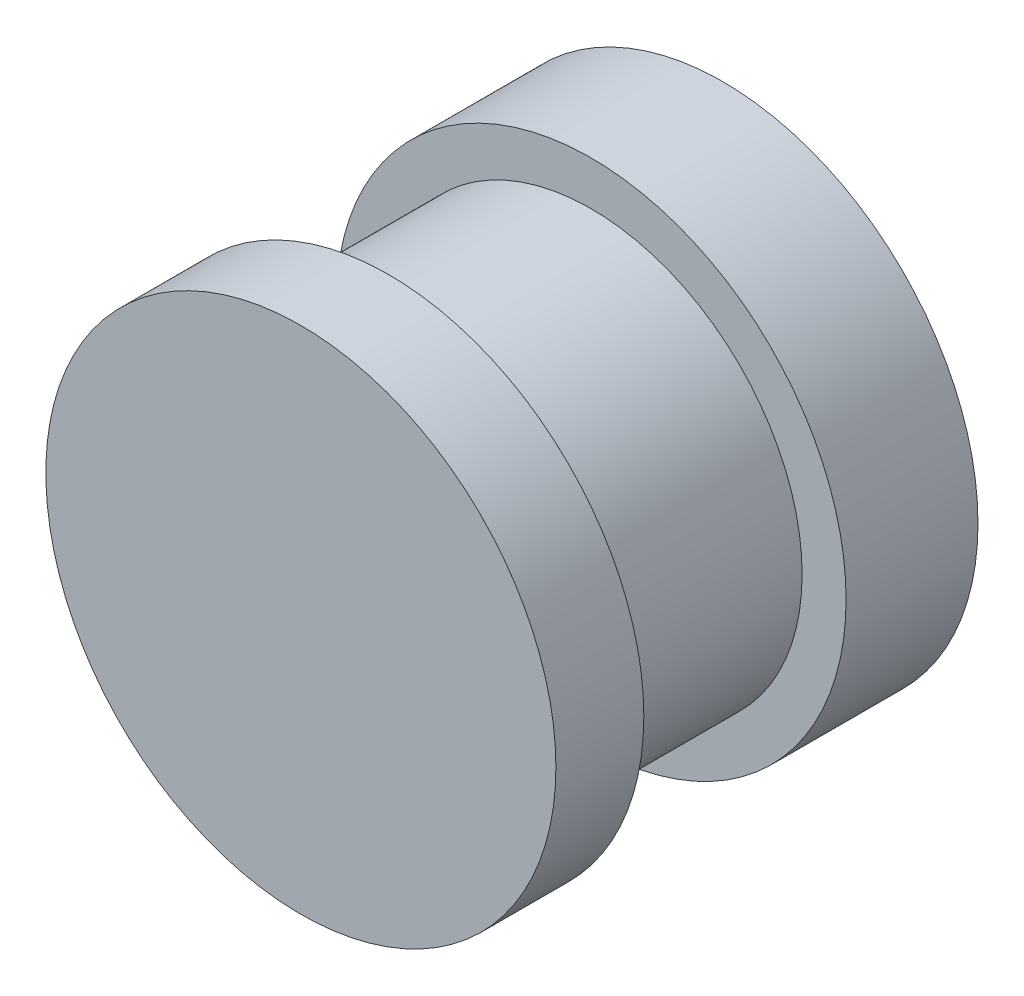
ISO-10303-21;
HEADER;
FILE_DESCRIPTION(('STEP AP214'),'2;1');
FILE_NAME('part.step','',(''),(''),'','','');
FILE_SCHEMA(('AUTOMOTIVE_DESIGN { 1 0 10303 214 1 1 1 1 }'));
ENDSEC;
DATA;
#1=APPLICATION_CONTEXT('core data for automotive mechanical design processes');
#2=APPLICATION_PROTOCOL_DEFINITION('international standard','automotive_design',2000,#1);
#3=PRODUCT_CONTEXT('',#1,'mechanical');
#4=PRODUCT('Part','Part','',(#3));
#5=PRODUCT_RELATED_PRODUCT_CATEGORY('part','',(#4));
#6=PRODUCT_DEFINITION_FORMATION('','',#4);
#7=PRODUCT_DEFINITION_CONTEXT('part definition',#1,'design');
#8=PRODUCT_DEFINITION('design','',#6,#7);
#9=PRODUCT_DEFINITION_SHAPE('','',#8);
#10=(LENGTH_UNIT() NAMED_UNIT(*) SI_UNIT(.MILLI.,.METRE.));
#11=(NAMED_UNIT(*) PLANE_ANGLE_UNIT() SI_UNIT($,.RADIAN.));
#12=(NAMED_UNIT(*) SI_UNIT($,.STERADIAN.) SOLID_ANGLE_UNIT());
#13=UNCERTAINTY_MEASURE_WITH_UNIT(LENGTH_MEASURE(1.E-05),#10,'distance_accuracy_value','');
#14=(GEOMETRIC_REPRESENTATION_CONTEXT(3) GLOBAL_UNCERTAINTY_ASSIGNED_CONTEXT((#13)) GLOBAL_UNIT_ASSIGNED_CONTEXT((#10,
#11,#12)) REPRESENTATION_CONTEXT('',''));
#15=CARTESIAN_POINT('',(0.,0.,0.));
#16=DIRECTION('',(0.,0.,1.));
#17=DIRECTION('',(1.,0.,0.));
#18=AXIS2_PLACEMENT_3D('',#15,#16,#17);
#19=CARTESIAN_POINT('',(0.,0.,1.5));
#20=DIRECTION('',(0.,0.,-1.));
#21=DIRECTION('',(-1.,0.,0.));
#22=AXIS2_PLACEMENT_3D('',#19,#20,#21);
#23=CYLINDRICAL_SURFACE('',#22,2.9);
#24=CARTESIAN_POINT('',(0.,0.,1.5));
#25=DIRECTION('',(0.,0.,1.));
#26=DIRECTION('',(1.,0.,0.));
#27=AXIS2_PLACEMENT_3D('',#24,#25,#26);
#28=CIRCLE('',#27,2.9);
#29=CARTESIAN_POINT('',(2.9,0.,1.5));
#30=VERTEX_POINT('',#29);
#31=EDGE_CURVE('E42',#30,#30,#28,.T.);
#32=ORIENTED_EDGE('',*,*,#31,.F.);
#33=EDGE_LOOP('',(#32));
#34=FACE_BOUND('',#33,.T.);
#35=CARTESIAN_POINT('',(0.,0.,0.));
#36=DIRECTION('',(0.,0.,1.));
#37=DIRECTION('',(1.,0.,0.));
#38=AXIS2_PLACEMENT_3D('',#35,#36,#37);
#39=CIRCLE('',#38,2.9);
#40=CARTESIAN_POINT('',(2.9,0.,0.));
#41=VERTEX_POINT('',#40);
#42=EDGE_CURVE('E38',#41,#41,#39,.T.);
#43=ORIENTED_EDGE('',*,*,#42,.T.);
#44=EDGE_LOOP('',(#43));
#45=FACE_BOUND('',#44,.T.);
#46=ADVANCED_FACE('F35',(#34,#45),#23,.T.);
#47=CARTESIAN_POINT('',(0.,0.,1.5));
#48=DIRECTION('',(0.,0.,1.));
#49=DIRECTION('',(1.,0.,0.));
#50=AXIS2_PLACEMENT_3D('',#47,#48,#49);
#51=PLANE('',#50);
#52=CARTESIAN_POINT('',(0.,0.,1.5));
#53=DIRECTION('',(0.,0.,1.));
#54=DIRECTION('',(1.,0.,0.));
#55=AXIS2_PLACEMENT_3D('',#52,#53,#54);
#56=CIRCLE('',#55,2.4);
#57=CARTESIAN_POINT('',(2.4,0.,1.5));
#58=VERTEX_POINT('',#57);
#59=EDGE_CURVE('E10',#58,#58,#56,.T.);
#60=ORIENTED_EDGE('',*,*,#59,.F.);
#61=EDGE_LOOP('',(#60));
#62=FACE_BOUND('',#61,.T.);
#63=ORIENTED_EDGE('',*,*,#31,.T.);
#64=EDGE_LOOP('',(#63));
#65=FACE_BOUND('',#64,.T.);
#66=ADVANCED_FACE('F76',(#62,#65),#51,.T.);
#67=CARTESIAN_POINT('',(0.,0.,0.));
#68=DIRECTION('',(0.,0.,1.));
#69=DIRECTION('',(1.,0.,0.));
#70=AXIS2_PLACEMENT_3D('',#67,#68,#69);
#71=PLANE('',#70);
#72=ORIENTED_EDGE('',*,*,#42,.F.);
#73=EDGE_LOOP('',(#72));
#74=FACE_BOUND('',#73,.T.);
#75=ADVANCED_FACE('F81',(#74),#71,.F.);
#76=CARTESIAN_POINT('',(0.,0.,3.8));
#77=DIRECTION('',(0.,0.,-1.));
#78=DIRECTION('',(-1.,0.,0.));
#79=AXIS2_PLACEMENT_3D('',#76,#77,#78);
#80=CYLINDRICAL_SURFACE('',#79,2.4);
#81=CARTESIAN_POINT('',(0.,0.,3.8));
#82=DIRECTION('',(0.,0.,1.));
#83=DIRECTION('',(1.,0.,0.));
#84=AXIS2_PLACEMENT_3D('',#81,#82,#83);
#85=CIRCLE('',#84,2.4);
#86=CARTESIAN_POINT('',(2.4,0.,3.8));
#87=VERTEX_POINT('',#86);
#88=EDGE_CURVE('E48',#87,#87,#85,.T.);
#89=ORIENTED_EDGE('',*,*,#88,.F.);
#90=EDGE_LOOP('',(#89));
#91=FACE_BOUND('',#90,.T.);
#92=ORIENTED_EDGE('',*,*,#59,.T.);
#93=EDGE_LOOP('',(#92));
#94=FACE_BOUND('',#93,.T.);
#95=ADVANCED_FACE('F63',(#91,#94),#80,.T.);
#96=CARTESIAN_POINT('',(0.,0.,4.8));
#97=DIRECTION('',(0.,0.,-1.));
#98=DIRECTION('',(-1.,0.,0.));
#99=AXIS2_PLACEMENT_3D('',#96,#97,#98);
#100=CYLINDRICAL_SURFACE('',#99,2.9);
#101=CARTESIAN_POINT('',(0.,0.,4.8));
#102=DIRECTION('',(0.,0.,1.));
#103=DIRECTION('',(1.,0.,0.));
#104=AXIS2_PLACEMENT_3D('',#101,#102,#103);
#105=CIRCLE('',#104,2.9);
#106=CARTESIAN_POINT('',(2.9,0.,4.8));
#107=VERTEX_POINT('',#106);
#108=EDGE_CURVE('E51',#107,#107,#105,.T.);
#109=ORIENTED_EDGE('',*,*,#108,.F.);
#110=EDGE_LOOP('',(#109));
#111=FACE_BOUND('',#110,.T.);
#112=CARTESIAN_POINT('',(0.,0.,3.8));
#113=DIRECTION('',(0.,0.,1.));
#114=DIRECTION('',(1.,0.,0.));
#115=AXIS2_PLACEMENT_3D('',#112,#113,#114);
#116=CIRCLE('',#115,2.9);
#117=CARTESIAN_POINT('',(2.9,0.,3.8));
#118=VERTEX_POINT('',#117);
#119=EDGE_CURVE('E52',#118,#118,#116,.T.);
#120=ORIENTED_EDGE('',*,*,#119,.T.);
#121=EDGE_LOOP('',(#120));
#122=FACE_BOUND('',#121,.T.);
#123=ADVANCED_FACE('F60',(#111,#122),#100,.T.);
#124=CARTESIAN_POINT('',(0.,0.,4.8));
#125=DIRECTION('',(0.,0.,1.));
#126=DIRECTION('',(1.,0.,0.));
#127=AXIS2_PLACEMENT_3D('',#124,#125,#126);
#128=PLANE('',#127);
#129=ORIENTED_EDGE('',*,*,#108,.T.);
#130=EDGE_LOOP('',(#129));
#131=FACE_BOUND('',#130,.T.);
#132=ADVANCED_FACE('F58',(#131),#128,.T.);
#133=CARTESIAN_POINT('',(0.,0.,3.8));
#134=DIRECTION('',(0.,0.,1.));
#135=DIRECTION('',(1.,0.,0.));
#136=AXIS2_PLACEMENT_3D('',#133,#134,#135);
#137=PLANE('',#136);
#138=ORIENTED_EDGE('',*,*,#88,.T.);
#139=EDGE_LOOP('',(#138));
#140=FACE_BOUND('',#139,.T.);
#141=ORIENTED_EDGE('',*,*,#119,.F.);
#142=EDGE_LOOP('',(#141));
#143=FACE_BOUND('',#142,.T.);
#144=ADVANCED_FACE('F67',(#140,#143),#137,.F.);
#145=CLOSED_SHELL('',(#46,#66,#75,#95,#123,#132,#144));
#146=MANIFOLD_SOLID_BREP('B2',#145);
#147=ADVANCED_BREP_SHAPE_REPRESENTATION('',(#18,#146),#14);
#148=SHAPE_DEFINITION_REPRESENTATION(#9,#147);
ENDSEC;
END-ISO-10303-21;
